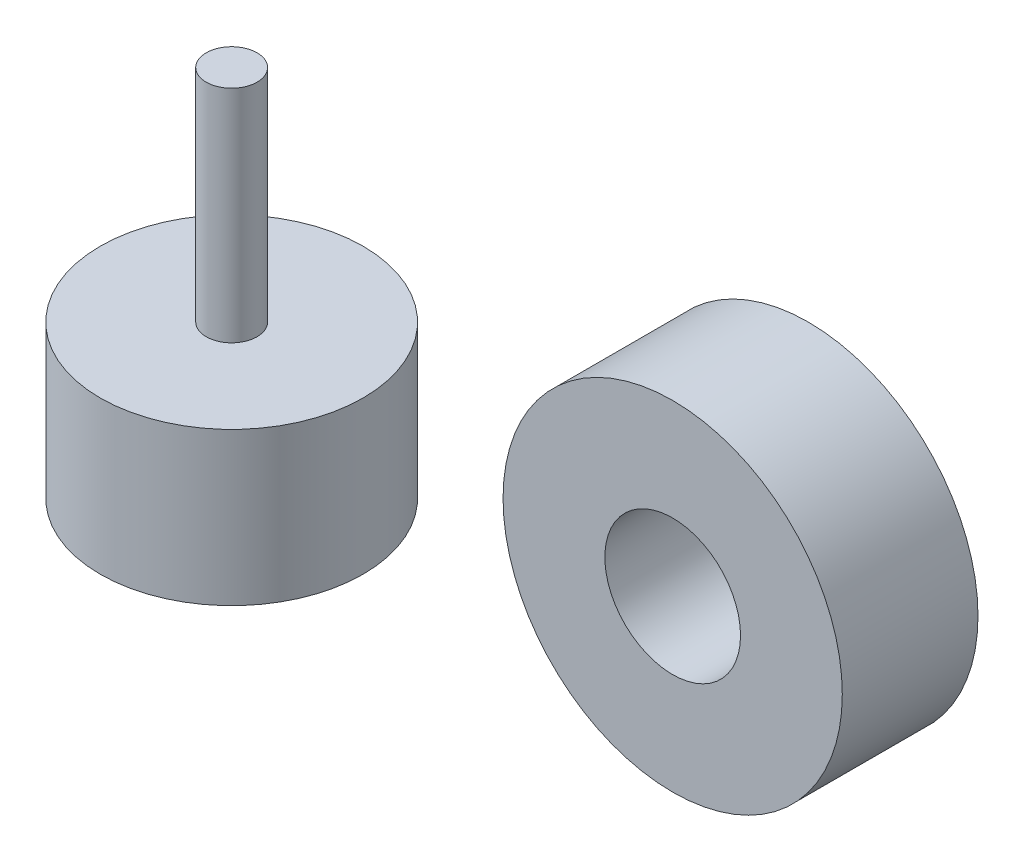
ISO-10303-21;
HEADER;
FILE_DESCRIPTION(('STEP AP214'),'2;1');
FILE_NAME('part.step','',(''),(''),'','','');
FILE_SCHEMA(('AUTOMOTIVE_DESIGN { 1 0 10303 214 1 1 1 1 }'));
ENDSEC;
DATA;
#1=APPLICATION_CONTEXT('core data for automotive mechanical design processes');
#2=APPLICATION_PROTOCOL_DEFINITION('international standard','automotive_design',2000,#1);
#3=PRODUCT_CONTEXT('',#1,'mechanical');
#4=PRODUCT('Part','Part','',(#3));
#5=PRODUCT_RELATED_PRODUCT_CATEGORY('part','',(#4));
#6=PRODUCT_DEFINITION_FORMATION('','',#4);
#7=PRODUCT_DEFINITION_CONTEXT('part definition',#1,'design');
#8=PRODUCT_DEFINITION('design','',#6,#7);
#9=PRODUCT_DEFINITION_SHAPE('','',#8);
#10=(LENGTH_UNIT() NAMED_UNIT(*) SI_UNIT(.MILLI.,.METRE.));
#11=(NAMED_UNIT(*) PLANE_ANGLE_UNIT() SI_UNIT($,.RADIAN.));
#12=(NAMED_UNIT(*) SI_UNIT($,.STERADIAN.) SOLID_ANGLE_UNIT());
#13=UNCERTAINTY_MEASURE_WITH_UNIT(LENGTH_MEASURE(1.E-05),#10,'distance_accuracy_value','');
#14=(GEOMETRIC_REPRESENTATION_CONTEXT(3) GLOBAL_UNCERTAINTY_ASSIGNED_CONTEXT((#13)) GLOBAL_UNIT_ASSIGNED_CONTEXT((#10,
#11,#12)) REPRESENTATION_CONTEXT('',''));
#15=CARTESIAN_POINT('',(0.,0.,0.));
#16=DIRECTION('',(0.,0.,1.));
#17=DIRECTION('',(1.,0.,0.));
#18=AXIS2_PLACEMENT_3D('',#15,#16,#17);
#19=CARTESIAN_POINT('',(0.,-7.5,0.));
#20=DIRECTION('',(0.,-1.,0.));
#21=DIRECTION('',(0.,0.,-1.));
#22=AXIS2_PLACEMENT_3D('',#19,#20,#21);
#23=CYLINDRICAL_SURFACE('',#22,7.75);
#24=CARTESIAN_POINT('',(0.,-3.,0.));
#25=DIRECTION('',(0.,-1.,0.));
#26=DIRECTION('',(0.,0.,-1.));
#27=AXIS2_PLACEMENT_3D('',#24,#25,#26);
#28=CIRCLE('',#27,7.75);
#29=CARTESIAN_POINT('',(0.,-3.,-7.75));
#30=VERTEX_POINT('',#29);
#31=EDGE_CURVE('E56',#30,#30,#28,.T.);
#32=ORIENTED_EDGE('',*,*,#31,.T.);
#33=EDGE_LOOP('',(#32));
#34=FACE_BOUND('',#33,.T.);
#35=CARTESIAN_POINT('',(0.,-12.,0.));
#36=DIRECTION('',(0.,-1.,0.));
#37=DIRECTION('',(0.,0.,-1.));
#38=AXIS2_PLACEMENT_3D('',#35,#36,#37);
#39=CIRCLE('',#38,7.75);
#40=CARTESIAN_POINT('',(0.,-12.,-7.75));
#41=VERTEX_POINT('',#40);
#42=EDGE_CURVE('E48',#41,#41,#39,.T.);
#43=ORIENTED_EDGE('',*,*,#42,.F.);
#44=EDGE_LOOP('',(#43));
#45=FACE_BOUND('',#44,.T.);
#46=ADVANCED_FACE('F45',(#34,#45),#23,.T.);
#47=CARTESIAN_POINT('',(0.,-12.,0.));
#48=DIRECTION('',(0.,-1.,0.));
#49=DIRECTION('',(0.,0.,-1.));
#50=AXIS2_PLACEMENT_3D('',#47,#48,#49);
#51=PLANE('',#50);
#52=ORIENTED_EDGE('',*,*,#42,.T.);
#53=EDGE_LOOP('',(#52));
#54=FACE_BOUND('',#53,.T.);
#55=ADVANCED_FACE('F76',(#54),#51,.T.);
#56=CARTESIAN_POINT('',(0.,-3.,0.));
#57=DIRECTION('',(0.,1.,0.));
#58=DIRECTION('',(0.,0.,1.));
#59=AXIS2_PLACEMENT_3D('',#56,#57,#58);
#60=PLANE('',#59);
#61=CARTESIAN_POINT('',(0.,-3.,0.));
#62=DIRECTION('',(0.,1.,0.));
#63=DIRECTION('',(0.,0.,1.));
#64=AXIS2_PLACEMENT_3D('',#61,#62,#63);
#65=CIRCLE('',#64,1.5);
#66=CARTESIAN_POINT('',(0.,-3.,-1.5));
#67=VERTEX_POINT('',#66);
#68=EDGE_CURVE('E11',#67,#67,#65,.T.);
#69=ORIENTED_EDGE('',*,*,#68,.F.);
#70=EDGE_LOOP('',(#69));
#71=FACE_BOUND('',#70,.T.);
#72=ORIENTED_EDGE('',*,*,#31,.F.);
#73=EDGE_LOOP('',(#72));
#74=FACE_BOUND('',#73,.T.);
#75=ADVANCED_FACE('F69',(#71,#74),#60,.T.);
#76=CARTESIAN_POINT('',(0.,10.,0.));
#77=DIRECTION('',(0.,-1.,0.));
#78=DIRECTION('',(0.,0.,-1.));
#79=AXIS2_PLACEMENT_3D('',#76,#77,#78);
#80=CYLINDRICAL_SURFACE('',#79,1.5);
#81=CARTESIAN_POINT('',(0.,10.,0.));
#82=DIRECTION('',(0.,1.,0.));
#83=DIRECTION('',(0.,0.,1.));
#84=AXIS2_PLACEMENT_3D('',#81,#82,#83);
#85=CIRCLE('',#84,1.5);
#86=CARTESIAN_POINT('',(0.,10.,-1.5));
#87=VERTEX_POINT('',#86);
#88=EDGE_CURVE('E58',#87,#87,#85,.T.);
#89=CARTESIAN_POINT('',(0.,10.,-1.5));
#90=CARTESIAN_POINT('',(0.,9.86458333333333,-1.5));
#91=CARTESIAN_POINT('',(0.,9.72916666666667,-1.5));
#92=CARTESIAN_POINT('',(0.,9.45833333333333,-1.5));
#93=CARTESIAN_POINT('',(0.,9.32291666666666,-1.5));
#94=CARTESIAN_POINT('',(0.,9.05208333333333,-1.5));
#95=CARTESIAN_POINT('',(0.,8.91666666666666,-1.5));
#96=CARTESIAN_POINT('',(0.,8.64583333333333,-1.5));
#97=CARTESIAN_POINT('',(0.,8.51041666666666,-1.5));
#98=CARTESIAN_POINT('',(0.,8.23958333333333,-1.5));
#99=CARTESIAN_POINT('',(0.,8.10416666666666,-1.5));
#100=CARTESIAN_POINT('',(0.,7.83333333333333,-1.5));
#101=CARTESIAN_POINT('',(0.,7.69791666666666,-1.5));
#102=CARTESIAN_POINT('',(0.,7.42708333333333,-1.5));
#103=CARTESIAN_POINT('',(0.,7.29166666666666,-1.5));
#104=CARTESIAN_POINT('',(0.,7.02083333333333,-1.5));
#105=CARTESIAN_POINT('',(0.,6.88541666666666,-1.5));
#106=CARTESIAN_POINT('',(0.,6.61458333333333,-1.5));
#107=CARTESIAN_POINT('',(0.,6.47916666666666,-1.5));
#108=CARTESIAN_POINT('',(0.,6.20833333333333,-1.5));
#109=CARTESIAN_POINT('',(0.,6.07291666666667,-1.5));
#110=CARTESIAN_POINT('',(0.,5.80208333333333,-1.5));
#111=CARTESIAN_POINT('',(0.,5.66666666666666,-1.5));
#112=CARTESIAN_POINT('',(0.,5.39583333333333,-1.5));
#113=CARTESIAN_POINT('',(0.,5.26041666666666,-1.5));
#114=CARTESIAN_POINT('',(0.,4.98958333333333,-1.5));
#115=CARTESIAN_POINT('',(0.,4.85416666666666,-1.5));
#116=CARTESIAN_POINT('',(0.,4.58333333333333,-1.5));
#117=CARTESIAN_POINT('',(0.,4.44791666666666,-1.5));
#118=CARTESIAN_POINT('',(0.,4.17708333333333,-1.5));
#119=CARTESIAN_POINT('',(0.,4.04166666666667,-1.5));
#120=CARTESIAN_POINT('',(0.,3.77083333333333,-1.5));
#121=CARTESIAN_POINT('',(0.,3.63541666666666,-1.5));
#122=CARTESIAN_POINT('',(0.,3.36458333333333,-1.5));
#123=CARTESIAN_POINT('',(0.,3.22916666666666,-1.5));
#124=CARTESIAN_POINT('',(0.,2.95833333333333,-1.5));
#125=CARTESIAN_POINT('',(0.,2.82291666666666,-1.5));
#126=CARTESIAN_POINT('',(0.,2.55208333333333,-1.5));
#127=CARTESIAN_POINT('',(0.,2.41666666666666,-1.5));
#128=CARTESIAN_POINT('',(0.,2.14583333333333,-1.5));
#129=CARTESIAN_POINT('',(0.,2.01041666666667,-1.5));
#130=CARTESIAN_POINT('',(0.,1.73958333333333,-1.5));
#131=CARTESIAN_POINT('',(0.,1.60416666666667,-1.5));
#132=CARTESIAN_POINT('',(0.,1.33333333333333,-1.5));
#133=CARTESIAN_POINT('',(0.,1.19791666666667,-1.5));
#134=CARTESIAN_POINT('',(0.,0.927083333333332,-1.5));
#135=CARTESIAN_POINT('',(0.,0.791666666666666,-1.5));
#136=CARTESIAN_POINT('',(0.,0.520833333333332,-1.5));
#137=CARTESIAN_POINT('',(0.,0.385416666666665,-1.5));
#138=CARTESIAN_POINT('',(0.,0.114583333333332,-1.5));
#139=CARTESIAN_POINT('',(0.,-0.0208333333333339,-1.5));
#140=CARTESIAN_POINT('',(0.,-0.291666666666667,-1.5));
#141=CARTESIAN_POINT('',(0.,-0.427083333333334,-1.5));
#142=CARTESIAN_POINT('',(0.,-0.697916666666667,-1.5));
#143=CARTESIAN_POINT('',(0.,-0.833333333333334,-1.5));
#144=CARTESIAN_POINT('',(0.,-1.10416666666667,-1.5));
#145=CARTESIAN_POINT('',(0.,-1.23958333333333,-1.5));
#146=CARTESIAN_POINT('',(0.,-1.51041666666667,-1.5));
#147=CARTESIAN_POINT('',(0.,-1.64583333333333,-1.5));
#148=CARTESIAN_POINT('',(0.,-1.91666666666667,-1.5));
#149=CARTESIAN_POINT('',(0.,-2.05208333333333,-1.5));
#150=CARTESIAN_POINT('',(0.,-2.32291666666667,-1.5));
#151=CARTESIAN_POINT('',(0.,-2.45833333333333,-1.5));
#152=CARTESIAN_POINT('',(0.,-2.72916666666667,-1.5));
#153=CARTESIAN_POINT('',(0.,-2.86458333333333,-1.5));
#154=CARTESIAN_POINT('',(0.,-3.,-1.5));
#155=B_SPLINE_CURVE_WITH_KNOTS('',3,(#89,#90,#91,#92,#93,#94,#95,#96,#97,#98,#99,#100,#101,#102,
#103,#104,#105,#106,#107,#108,#109,#110,#111,#112,#113,#114,#115,#116,#117,#118,#119,#120,#121,
#122,#123,#124,#125,#126,#127,#128,#129,#130,#131,#132,#133,#134,#135,#136,#137,#138,#139,#140,
#141,#142,#143,#144,#145,#146,#147,#148,#149,#150,#151,#152,#153,#154),.UNSPECIFIED.,.F.,.F.,(4,
2,2,2,2,2,2,2,2,2,2,2,2,2,2,2,2,2,2,2,2,2,2,2,2,2,2,2,2,2,2,2,4),(0.,0.40625,0.812500000000001,
1.21875,1.625,2.03125,2.4375,2.84375,3.25,3.65625,4.0625,4.46875,4.875,5.28125,5.6875,6.09375,
6.5,6.90625,7.3125,7.71875,8.125,8.53125,8.9375,9.34375,9.75,10.15625,10.5625,10.96875,11.375,
11.78125,12.1875,12.59375,13.),.UNSPECIFIED.);
#156=EDGE_CURVE('BSEAM67',#87,#67,#155,.T.);
#157=ORIENTED_EDGE('',*,*,#88,.F.);
#158=ORIENTED_EDGE('',*,*,#68,.T.);
#159=ORIENTED_EDGE('',*,*,#156,.T.);
#160=ORIENTED_EDGE('',*,*,#156,.F.);
#161=EDGE_LOOP('',(#157,#159,#158,#160));
#162=FACE_BOUND('',#161,.T.);
#163=ADVANCED_FACE('F67',(#162),#80,.T.);
#164=CARTESIAN_POINT('',(0.,10.,0.));
#165=DIRECTION('',(0.,1.,0.));
#166=DIRECTION('',(0.,0.,1.));
#167=AXIS2_PLACEMENT_3D('',#164,#165,#166);
#168=PLANE('',#167);
#169=ORIENTED_EDGE('',*,*,#88,.T.);
#170=EDGE_LOOP('',(#169));
#171=FACE_BOUND('',#170,.T.);
#172=ADVANCED_FACE('F65',(#171),#168,.T.);
#173=CLOSED_SHELL('',(#46,#55,#75,#163,#172));
#174=MANIFOLD_SOLID_BREP('B2',#173);
#175=CARTESIAN_POINT('',(30.,0.,4.));
#176=DIRECTION('',(0.,0.,1.));
#177=DIRECTION('',(1.,0.,0.));
#178=AXIS2_PLACEMENT_3D('',#175,#176,#177);
#179=PLANE('',#178);
#180=CARTESIAN_POINT('',(30.,0.,4.));
#181=DIRECTION('',(0.,0.,1.));
#182=DIRECTION('',(1.,0.,0.));
#183=AXIS2_PLACEMENT_3D('',#180,#181,#182);
#184=CIRCLE('',#183,10.);
#185=CARTESIAN_POINT('',(40.,0.,4.));
#186=VERTEX_POINT('',#185);
#187=EDGE_CURVE('E44',#186,#186,#184,.T.);
#188=ORIENTED_EDGE('',*,*,#187,.T.);
#189=EDGE_LOOP('',(#188));
#190=FACE_BOUND('',#189,.T.);
#191=CARTESIAN_POINT('',(30.,0.,4.));
#192=DIRECTION('',(0.,0.,1.));
#193=DIRECTION('',(1.,0.,0.));
#194=AXIS2_PLACEMENT_3D('',#191,#192,#193);
#195=CIRCLE('',#194,4.00000000000001);
#196=CARTESIAN_POINT('',(34.,0.,4.));
#197=VERTEX_POINT('',#196);
#198=EDGE_CURVE('E129',#197,#197,#195,.T.);
#199=ORIENTED_EDGE('',*,*,#198,.F.);
#200=EDGE_LOOP('',(#199));
#201=FACE_BOUND('',#200,.T.);
#202=ADVANCED_FACE('F116',(#190,#201),#179,.T.);
#203=CARTESIAN_POINT('',(30.,0.,-4.));
#204=DIRECTION('',(0.,0.,1.));
#205=DIRECTION('',(1.,0.,0.));
#206=AXIS2_PLACEMENT_3D('',#203,#204,#205);
#207=PLANE('',#206);
#208=CARTESIAN_POINT('',(30.,0.,-4.));
#209=DIRECTION('',(0.,0.,1.));
#210=DIRECTION('',(1.,0.,0.));
#211=AXIS2_PLACEMENT_3D('',#208,#209,#210);
#212=CIRCLE('',#211,10.);
#213=CARTESIAN_POINT('',(40.,0.,-4.));
#214=VERTEX_POINT('',#213);
#215=EDGE_CURVE('E120',#214,#214,#212,.T.);
#216=ORIENTED_EDGE('',*,*,#215,.F.);
#217=EDGE_LOOP('',(#216));
#218=FACE_BOUND('',#217,.T.);
#219=CARTESIAN_POINT('',(30.,0.,-4.));
#220=DIRECTION('',(0.,0.,1.));
#221=DIRECTION('',(1.,0.,0.));
#222=AXIS2_PLACEMENT_3D('',#219,#220,#221);
#223=CIRCLE('',#222,4.00000000000001);
#224=CARTESIAN_POINT('',(34.,0.,-4.));
#225=VERTEX_POINT('',#224);
#226=EDGE_CURVE('E131',#225,#225,#223,.T.);
#227=ORIENTED_EDGE('',*,*,#226,.T.);
#228=EDGE_LOOP('',(#227));
#229=FACE_BOUND('',#228,.T.);
#230=ADVANCED_FACE('F143',(#218,#229),#207,.F.);
#231=CARTESIAN_POINT('',(30.,0.,4.));
#232=DIRECTION('',(0.,0.,-1.));
#233=DIRECTION('',(-1.,0.,0.));
#234=AXIS2_PLACEMENT_3D('',#231,#232,#233);
#235=CYLINDRICAL_SURFACE('',#234,10.);
#236=ORIENTED_EDGE('',*,*,#187,.F.);
#237=EDGE_LOOP('',(#236));
#238=FACE_BOUND('',#237,.T.);
#239=ORIENTED_EDGE('',*,*,#215,.T.);
#240=EDGE_LOOP('',(#239));
#241=FACE_BOUND('',#240,.T.);
#242=ADVANCED_FACE('F118',(#238,#241),#235,.T.);
#243=CARTESIAN_POINT('',(30.,0.,4.));
#244=DIRECTION('',(0.,0.,-1.));
#245=DIRECTION('',(-1.,0.,0.));
#246=AXIS2_PLACEMENT_3D('',#243,#244,#245);
#247=CYLINDRICAL_SURFACE('',#246,4.00000000000001);
#248=ORIENTED_EDGE('',*,*,#198,.T.);
#249=EDGE_LOOP('',(#248));
#250=FACE_BOUND('',#249,.T.);
#251=ORIENTED_EDGE('',*,*,#226,.F.);
#252=EDGE_LOOP('',(#251));
#253=FACE_BOUND('',#252,.T.);
#254=ADVANCED_FACE('F139',(#250,#253),#247,.F.);
#255=CLOSED_SHELL('',(#202,#230,#242,#254));
#256=MANIFOLD_SOLID_BREP('B6',#255);
#257=ADVANCED_BREP_SHAPE_REPRESENTATION('',(#18,#174,#256),#14);
#258=SHAPE_DEFINITION_REPRESENTATION(#9,#257);
ENDSEC;
END-ISO-10303-21;
